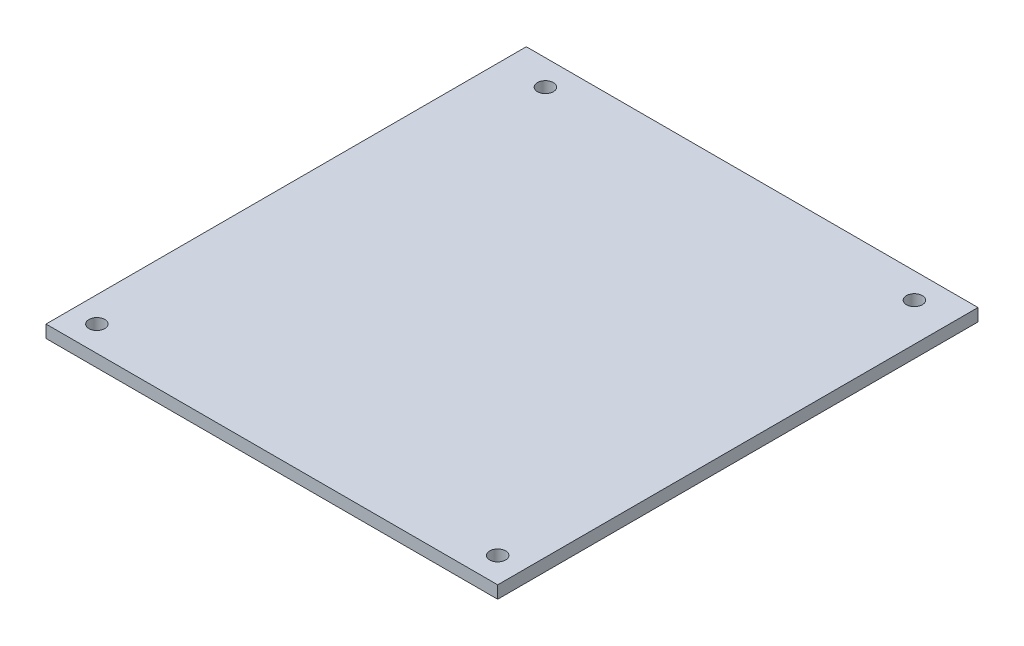
ISO-10303-21;
HEADER;
FILE_DESCRIPTION(('STEP AP214'),'2;1');
FILE_NAME('part.step','',(''),(''),'','','');
FILE_SCHEMA(('AUTOMOTIVE_DESIGN { 1 0 10303 214 1 1 1 1 }'));
ENDSEC;
DATA;
#1=APPLICATION_CONTEXT('core data for automotive mechanical design processes');
#2=APPLICATION_PROTOCOL_DEFINITION('international standard','automotive_design',2000,#1);
#3=PRODUCT_CONTEXT('',#1,'mechanical');
#4=PRODUCT('Part','Part','',(#3));
#5=PRODUCT_RELATED_PRODUCT_CATEGORY('part','',(#4));
#6=PRODUCT_DEFINITION_FORMATION('','',#4);
#7=PRODUCT_DEFINITION_CONTEXT('part definition',#1,'design');
#8=PRODUCT_DEFINITION('design','',#6,#7);
#9=PRODUCT_DEFINITION_SHAPE('','',#8);
#10=(LENGTH_UNIT() NAMED_UNIT(*) SI_UNIT(.MILLI.,.METRE.));
#11=(NAMED_UNIT(*) PLANE_ANGLE_UNIT() SI_UNIT($,.RADIAN.));
#12=(NAMED_UNIT(*) SI_UNIT($,.STERADIAN.) SOLID_ANGLE_UNIT());
#13=UNCERTAINTY_MEASURE_WITH_UNIT(LENGTH_MEASURE(1.E-05),#10,'distance_accuracy_value','');
#14=(GEOMETRIC_REPRESENTATION_CONTEXT(3) GLOBAL_UNCERTAINTY_ASSIGNED_CONTEXT((#13)) GLOBAL_UNIT_ASSIGNED_CONTEXT((#10,
#11,#12)) REPRESENTATION_CONTEXT('',''));
#15=CARTESIAN_POINT('',(0.,0.,0.));
#16=DIRECTION('',(0.,0.,1.));
#17=DIRECTION('',(1.,0.,0.));
#18=AXIS2_PLACEMENT_3D('',#15,#16,#17);
#19=CARTESIAN_POINT('',(45.085,2.5,47.9425));
#20=DIRECTION('',(-1.,0.,0.));
#21=DIRECTION('',(0.,0.,1.));
#22=AXIS2_PLACEMENT_3D('',#19,#20,#21);
#23=PLANE('',#22);
#24=DIRECTION('',(0.,0.,-1.));
#25=VECTOR('',#24,1.);
#26=CARTESIAN_POINT('',(45.085,0.,47.9425));
#27=LINE('',#26,#25);
#28=CARTESIAN_POINT('',(45.085,0.,47.9425));
#29=VERTEX_POINT('',#28);
#30=CARTESIAN_POINT('',(45.085,0.,-47.9425));
#31=VERTEX_POINT('',#30);
#32=EDGE_CURVE('E96',#29,#31,#27,.T.);
#33=ORIENTED_EDGE('',*,*,#32,.T.);
#34=DIRECTION('',(0.,-1.,0.));
#35=VECTOR('',#34,1.);
#36=CARTESIAN_POINT('',(45.085,2.5,-47.9425));
#37=LINE('',#36,#35);
#38=CARTESIAN_POINT('',(45.085,2.5,-47.9425));
#39=VERTEX_POINT('',#38);
#40=EDGE_CURVE('E11',#39,#31,#37,.T.);
#41=ORIENTED_EDGE('',*,*,#40,.F.);
#42=DIRECTION('',(0.,0.,-1.));
#43=VECTOR('',#42,1.);
#44=CARTESIAN_POINT('',(45.085,2.5,47.9425));
#45=LINE('',#44,#43);
#46=CARTESIAN_POINT('',(45.085,2.5,47.9425));
#47=VERTEX_POINT('',#46);
#48=EDGE_CURVE('E84',#47,#39,#45,.T.);
#49=ORIENTED_EDGE('',*,*,#48,.F.);
#50=DIRECTION('',(0.,-1.,0.));
#51=VECTOR('',#50,1.);
#52=CARTESIAN_POINT('',(45.085,2.5,47.9425));
#53=LINE('',#52,#51);
#54=EDGE_CURVE('E92',#47,#29,#53,.T.);
#55=ORIENTED_EDGE('',*,*,#54,.T.);
#56=EDGE_LOOP('',(#33,#41,#49,#55));
#57=FACE_BOUND('',#56,.T.);
#58=ADVANCED_FACE('F33',(#57),#23,.F.);
#59=CARTESIAN_POINT('',(-45.085,2.5,-47.9425));
#60=DIRECTION('',(0.,0.,1.));
#61=DIRECTION('',(1.,0.,0.));
#62=AXIS2_PLACEMENT_3D('',#59,#60,#61);
#63=PLANE('',#62);
#64=DIRECTION('',(-1.,0.,0.));
#65=VECTOR('',#64,1.);
#66=CARTESIAN_POINT('',(-45.085,0.,-47.9425));
#67=LINE('',#66,#65);
#68=CARTESIAN_POINT('',(-45.085,0.,-47.9425));
#69=VERTEX_POINT('',#68);
#70=EDGE_CURVE('E88',#31,#69,#67,.T.);
#71=ORIENTED_EDGE('',*,*,#70,.T.);
#72=DIRECTION('',(0.,-1.,0.));
#73=VECTOR('',#72,1.);
#74=CARTESIAN_POINT('',(-45.085,2.5,-47.9425));
#75=LINE('',#74,#73);
#76=CARTESIAN_POINT('',(-45.085,2.5,-47.9425));
#77=VERTEX_POINT('',#76);
#78=EDGE_CURVE('E41',#77,#69,#75,.T.);
#79=ORIENTED_EDGE('',*,*,#78,.F.);
#80=DIRECTION('',(-1.,0.,0.));
#81=VECTOR('',#80,1.);
#82=CARTESIAN_POINT('',(-45.085,2.5,-47.9425));
#83=LINE('',#82,#81);
#84=EDGE_CURVE('E79',#39,#77,#83,.T.);
#85=ORIENTED_EDGE('',*,*,#84,.F.);
#86=ORIENTED_EDGE('',*,*,#40,.T.);
#87=EDGE_LOOP('',(#71,#79,#85,#86));
#88=FACE_BOUND('',#87,.T.);
#89=ADVANCED_FACE('F87',(#88),#63,.F.);
#90=CARTESIAN_POINT('',(-45.085,2.5,47.9425));
#91=DIRECTION('',(1.,0.,0.));
#92=DIRECTION('',(0.,0.,-1.));
#93=AXIS2_PLACEMENT_3D('',#90,#91,#92);
#94=PLANE('',#93);
#95=DIRECTION('',(0.,0.,1.));
#96=VECTOR('',#95,1.);
#97=CARTESIAN_POINT('',(-45.085,0.,47.9425));
#98=LINE('',#97,#96);
#99=CARTESIAN_POINT('',(-45.085,0.,47.9425));
#100=VERTEX_POINT('',#99);
#101=EDGE_CURVE('E66',#69,#100,#98,.T.);
#102=ORIENTED_EDGE('',*,*,#101,.T.);
#103=DIRECTION('',(0.,-1.,0.));
#104=VECTOR('',#103,1.);
#105=CARTESIAN_POINT('',(-45.085,2.5,47.9425));
#106=LINE('',#105,#104);
#107=CARTESIAN_POINT('',(-45.085,2.5,47.9425));
#108=VERTEX_POINT('',#107);
#109=EDGE_CURVE('E89',#108,#100,#106,.T.);
#110=ORIENTED_EDGE('',*,*,#109,.F.);
#111=DIRECTION('',(0.,0.,1.));
#112=VECTOR('',#111,1.);
#113=CARTESIAN_POINT('',(-45.085,2.5,47.9425));
#114=LINE('',#113,#112);
#115=EDGE_CURVE('E82',#77,#108,#114,.T.);
#116=ORIENTED_EDGE('',*,*,#115,.F.);
#117=ORIENTED_EDGE('',*,*,#78,.T.);
#118=EDGE_LOOP('',(#102,#110,#116,#117));
#119=FACE_BOUND('',#118,.T.);
#120=ADVANCED_FACE('F90',(#119),#94,.F.);
#121=CARTESIAN_POINT('',(-45.085,2.5,47.9425));
#122=DIRECTION('',(0.,0.,-1.));
#123=DIRECTION('',(-1.,0.,0.));
#124=AXIS2_PLACEMENT_3D('',#121,#122,#123);
#125=PLANE('',#124);
#126=DIRECTION('',(1.,0.,0.));
#127=VECTOR('',#126,1.);
#128=CARTESIAN_POINT('',(-45.085,0.,47.9425));
#129=LINE('',#128,#127);
#130=EDGE_CURVE('E72',#100,#29,#129,.T.);
#131=ORIENTED_EDGE('',*,*,#130,.T.);
#132=ORIENTED_EDGE('',*,*,#54,.F.);
#133=DIRECTION('',(1.,0.,0.));
#134=VECTOR('',#133,1.);
#135=CARTESIAN_POINT('',(-45.085,2.5,47.9425));
#136=LINE('',#135,#134);
#137=EDGE_CURVE('E49',#108,#47,#136,.T.);
#138=ORIENTED_EDGE('',*,*,#137,.F.);
#139=ORIENTED_EDGE('',*,*,#109,.T.);
#140=EDGE_LOOP('',(#131,#132,#138,#139));
#141=FACE_BOUND('',#140,.T.);
#142=ADVANCED_FACE('F104',(#141),#125,.F.);
#143=CARTESIAN_POINT('',(0.,2.5,0.));
#144=DIRECTION('',(0.,-1.,0.));
#145=DIRECTION('',(0.,0.,-1.));
#146=AXIS2_PLACEMENT_3D('',#143,#144,#145);
#147=PLANE('',#146);
#148=CARTESIAN_POINT('',(40.005,2.5,42.8625));
#149=DIRECTION('',(0.,1.,0.));
#150=DIRECTION('',(0.,0.,1.));
#151=AXIS2_PLACEMENT_3D('',#148,#149,#150);
#152=CIRCLE('',#151,1.5875);
#153=CARTESIAN_POINT('',(40.005,2.5,44.45));
#154=VERTEX_POINT('',#153);
#155=EDGE_CURVE('E128',#154,#154,#152,.T.);
#156=ORIENTED_EDGE('',*,*,#155,.F.);
#157=EDGE_LOOP('',(#156));
#158=FACE_BOUND('',#157,.T.);
#159=CARTESIAN_POINT('',(37.465,2.5,-42.8625));
#160=DIRECTION('',(0.,1.,0.));
#161=DIRECTION('',(0.,0.,1.));
#162=AXIS2_PLACEMENT_3D('',#159,#160,#161);
#163=CIRCLE('',#162,1.5875);
#164=CARTESIAN_POINT('',(37.465,2.5,-41.275));
#165=VERTEX_POINT('',#164);
#166=EDGE_CURVE('E122',#165,#165,#163,.T.);
#167=ORIENTED_EDGE('',*,*,#166,.F.);
#168=EDGE_LOOP('',(#167));
#169=FACE_BOUND('',#168,.T.);
#170=CARTESIAN_POINT('',(-36.195,2.5,-42.8625));
#171=DIRECTION('',(0.,1.,0.));
#172=DIRECTION('',(0.,0.,1.));
#173=AXIS2_PLACEMENT_3D('',#170,#171,#172);
#174=CIRCLE('',#173,1.5875);
#175=CARTESIAN_POINT('',(-36.195,2.5,-41.275));
#176=VERTEX_POINT('',#175);
#177=EDGE_CURVE('E116',#176,#176,#174,.T.);
#178=ORIENTED_EDGE('',*,*,#177,.F.);
#179=EDGE_LOOP('',(#178));
#180=FACE_BOUND('',#179,.T.);
#181=CARTESIAN_POINT('',(-40.005,2.5,42.8625));
#182=DIRECTION('',(0.,1.,0.));
#183=DIRECTION('',(0.,0.,1.));
#184=AXIS2_PLACEMENT_3D('',#181,#182,#183);
#185=CIRCLE('',#184,1.5875);
#186=CARTESIAN_POINT('',(-40.005,2.5,44.45));
#187=VERTEX_POINT('',#186);
#188=EDGE_CURVE('E110',#187,#187,#185,.T.);
#189=ORIENTED_EDGE('',*,*,#188,.F.);
#190=EDGE_LOOP('',(#189));
#191=FACE_BOUND('',#190,.T.);
#192=ORIENTED_EDGE('',*,*,#48,.T.);
#193=ORIENTED_EDGE('',*,*,#84,.T.);
#194=ORIENTED_EDGE('',*,*,#115,.T.);
#195=ORIENTED_EDGE('',*,*,#137,.T.);
#196=EDGE_LOOP('',(#192,#193,#194,#195));
#197=FACE_BOUND('',#196,.T.);
#198=ADVANCED_FACE('F80',(#158,#169,#180,#191,#197),#147,.F.);
#199=CARTESIAN_POINT('',(0.,0.,0.));
#200=DIRECTION('',(0.,-1.,0.));
#201=DIRECTION('',(0.,0.,-1.));
#202=AXIS2_PLACEMENT_3D('',#199,#200,#201);
#203=PLANE('',#202);
#204=CARTESIAN_POINT('',(40.005,0.,42.8625));
#205=DIRECTION('',(0.,1.,0.));
#206=DIRECTION('',(0.,0.,1.));
#207=AXIS2_PLACEMENT_3D('',#204,#205,#206);
#208=CIRCLE('',#207,1.5875);
#209=CARTESIAN_POINT('',(40.005,0.,44.45));
#210=VERTEX_POINT('',#209);
#211=EDGE_CURVE('E125',#210,#210,#208,.T.);
#212=ORIENTED_EDGE('',*,*,#211,.T.);
#213=EDGE_LOOP('',(#212));
#214=FACE_BOUND('',#213,.T.);
#215=CARTESIAN_POINT('',(37.465,0.,-42.8625));
#216=DIRECTION('',(0.,1.,0.));
#217=DIRECTION('',(0.,0.,1.));
#218=AXIS2_PLACEMENT_3D('',#215,#216,#217);
#219=CIRCLE('',#218,1.5875);
#220=CARTESIAN_POINT('',(37.465,0.,-41.275));
#221=VERTEX_POINT('',#220);
#222=EDGE_CURVE('E119',#221,#221,#219,.T.);
#223=ORIENTED_EDGE('',*,*,#222,.T.);
#224=EDGE_LOOP('',(#223));
#225=FACE_BOUND('',#224,.T.);
#226=CARTESIAN_POINT('',(-36.195,0.,-42.8625));
#227=DIRECTION('',(0.,1.,0.));
#228=DIRECTION('',(0.,0.,1.));
#229=AXIS2_PLACEMENT_3D('',#226,#227,#228);
#230=CIRCLE('',#229,1.5875);
#231=CARTESIAN_POINT('',(-36.195,0.,-41.275));
#232=VERTEX_POINT('',#231);
#233=EDGE_CURVE('E113',#232,#232,#230,.T.);
#234=ORIENTED_EDGE('',*,*,#233,.T.);
#235=EDGE_LOOP('',(#234));
#236=FACE_BOUND('',#235,.T.);
#237=CARTESIAN_POINT('',(-40.005,0.,42.8625));
#238=DIRECTION('',(0.,1.,0.));
#239=DIRECTION('',(0.,0.,1.));
#240=AXIS2_PLACEMENT_3D('',#237,#238,#239);
#241=CIRCLE('',#240,1.5875);
#242=CARTESIAN_POINT('',(-40.005,0.,44.45));
#243=VERTEX_POINT('',#242);
#244=EDGE_CURVE('E99',#243,#243,#241,.T.);
#245=ORIENTED_EDGE('',*,*,#244,.T.);
#246=EDGE_LOOP('',(#245));
#247=FACE_BOUND('',#246,.T.);
#248=ORIENTED_EDGE('',*,*,#32,.F.);
#249=ORIENTED_EDGE('',*,*,#130,.F.);
#250=ORIENTED_EDGE('',*,*,#101,.F.);
#251=ORIENTED_EDGE('',*,*,#70,.F.);
#252=EDGE_LOOP('',(#248,#249,#250,#251));
#253=FACE_BOUND('',#252,.T.);
#254=ADVANCED_FACE('F107',(#214,#225,#236,#247,#253),#203,.T.);
#255=CARTESIAN_POINT('',(-40.005,0.,42.8625));
#256=DIRECTION('',(0.,1.,0.));
#257=DIRECTION('',(0.,0.,1.));
#258=AXIS2_PLACEMENT_3D('',#255,#256,#257);
#259=CYLINDRICAL_SURFACE('',#258,1.5875);
#260=ORIENTED_EDGE('',*,*,#244,.F.);
#261=EDGE_LOOP('',(#260));
#262=FACE_BOUND('',#261,.T.);
#263=ORIENTED_EDGE('',*,*,#188,.T.);
#264=EDGE_LOOP('',(#263));
#265=FACE_BOUND('',#264,.T.);
#266=ADVANCED_FACE('F152',(#262,#265),#259,.F.);
#267=CARTESIAN_POINT('',(-36.195,0.,-42.8625));
#268=DIRECTION('',(0.,1.,0.));
#269=DIRECTION('',(0.,0.,1.));
#270=AXIS2_PLACEMENT_3D('',#267,#268,#269);
#271=CYLINDRICAL_SURFACE('',#270,1.5875);
#272=ORIENTED_EDGE('',*,*,#233,.F.);
#273=EDGE_LOOP('',(#272));
#274=FACE_BOUND('',#273,.T.);
#275=ORIENTED_EDGE('',*,*,#177,.T.);
#276=EDGE_LOOP('',(#275));
#277=FACE_BOUND('',#276,.T.);
#278=ADVANCED_FACE('F154',(#274,#277),#271,.F.);
#279=CARTESIAN_POINT('',(37.465,0.,-42.8625));
#280=DIRECTION('',(0.,1.,0.));
#281=DIRECTION('',(0.,0.,1.));
#282=AXIS2_PLACEMENT_3D('',#279,#280,#281);
#283=CYLINDRICAL_SURFACE('',#282,1.5875);
#284=ORIENTED_EDGE('',*,*,#222,.F.);
#285=EDGE_LOOP('',(#284));
#286=FACE_BOUND('',#285,.T.);
#287=ORIENTED_EDGE('',*,*,#166,.T.);
#288=EDGE_LOOP('',(#287));
#289=FACE_BOUND('',#288,.T.);
#290=ADVANCED_FACE('F139',(#286,#289),#283,.F.);
#291=CARTESIAN_POINT('',(40.005,0.,42.8625));
#292=DIRECTION('',(0.,1.,0.));
#293=DIRECTION('',(0.,0.,1.));
#294=AXIS2_PLACEMENT_3D('',#291,#292,#293);
#295=CYLINDRICAL_SURFACE('',#294,1.5875);
#296=ORIENTED_EDGE('',*,*,#211,.F.);
#297=EDGE_LOOP('',(#296));
#298=FACE_BOUND('',#297,.T.);
#299=ORIENTED_EDGE('',*,*,#155,.T.);
#300=EDGE_LOOP('',(#299));
#301=FACE_BOUND('',#300,.T.);
#302=ADVANCED_FACE('F136',(#298,#301),#295,.F.);
#303=CLOSED_SHELL('',(#58,#89,#120,#142,#198,#254,#266,#278,#290,#302));
#304=MANIFOLD_SOLID_BREP('B2',#303);
#305=ADVANCED_BREP_SHAPE_REPRESENTATION('',(#18,#304),#14);
#306=SHAPE_DEFINITION_REPRESENTATION(#9,#305);
ENDSEC;
END-ISO-10303-21;
